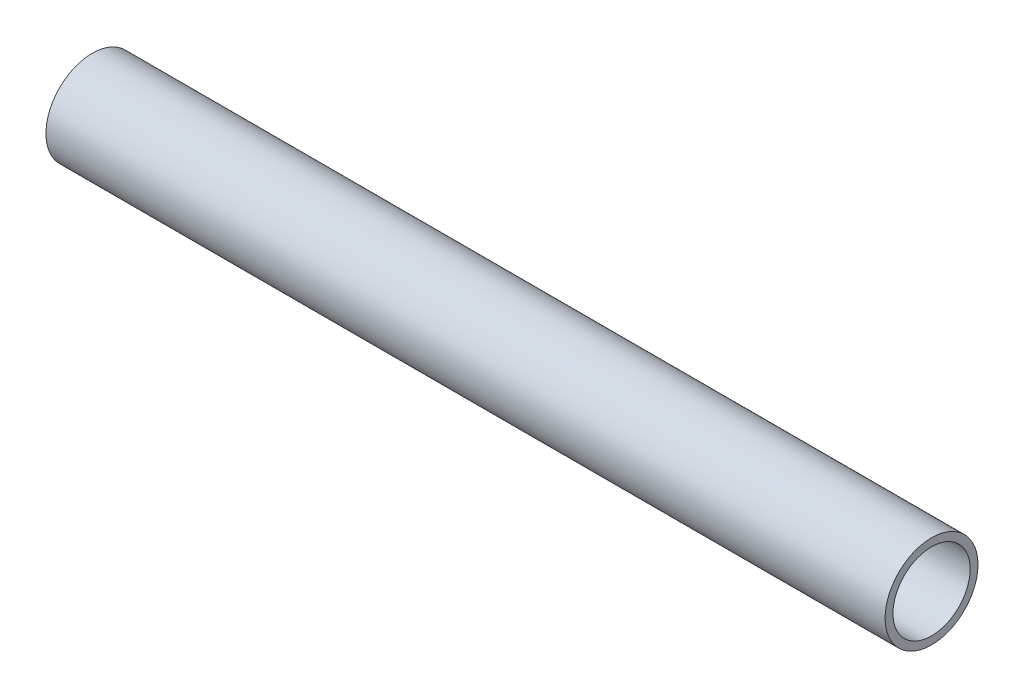
ISO-10303-21;
HEADER;
FILE_DESCRIPTION(('STEP AP214'),'2;1');
FILE_NAME('part.step','',(''),(''),'','','');
FILE_SCHEMA(('AUTOMOTIVE_DESIGN { 1 0 10303 214 1 1 1 1 }'));
ENDSEC;
DATA;
#1=APPLICATION_CONTEXT('core data for automotive mechanical design processes');
#2=APPLICATION_PROTOCOL_DEFINITION('international standard','automotive_design',2000,#1);
#3=PRODUCT_CONTEXT('',#1,'mechanical');
#4=PRODUCT('Part','Part','',(#3));
#5=PRODUCT_RELATED_PRODUCT_CATEGORY('part','',(#4));
#6=PRODUCT_DEFINITION_FORMATION('','',#4);
#7=PRODUCT_DEFINITION_CONTEXT('part definition',#1,'design');
#8=PRODUCT_DEFINITION('design','',#6,#7);
#9=PRODUCT_DEFINITION_SHAPE('','',#8);
#10=(LENGTH_UNIT() NAMED_UNIT(*) SI_UNIT(.MILLI.,.METRE.));
#11=(NAMED_UNIT(*) PLANE_ANGLE_UNIT() SI_UNIT($,.RADIAN.));
#12=(NAMED_UNIT(*) SI_UNIT($,.STERADIAN.) SOLID_ANGLE_UNIT());
#13=UNCERTAINTY_MEASURE_WITH_UNIT(LENGTH_MEASURE(1.E-05),#10,'distance_accuracy_value','');
#14=(GEOMETRIC_REPRESENTATION_CONTEXT(3) GLOBAL_UNCERTAINTY_ASSIGNED_CONTEXT((#13)) GLOBAL_UNIT_ASSIGNED_CONTEXT((#10,
#11,#12)) REPRESENTATION_CONTEXT('',''));
#15=CARTESIAN_POINT('',(0.,0.,0.));
#16=DIRECTION('',(0.,0.,1.));
#17=DIRECTION('',(1.,0.,0.));
#18=AXIS2_PLACEMENT_3D('',#15,#16,#17);
#19=CARTESIAN_POINT('',(190.5,0.,0.));
#20=DIRECTION('',(1.,0.,0.));
#21=DIRECTION('',(0.,0.,-1.));
#22=AXIS2_PLACEMENT_3D('',#19,#20,#21);
#23=PLANE('',#22);
#24=CARTESIAN_POINT('',(190.5,0.,0.));
#25=DIRECTION('',(1.,0.,0.));
#26=DIRECTION('',(0.,0.,-1.));
#27=AXIS2_PLACEMENT_3D('',#24,#25,#26);
#28=CIRCLE('',#27,21.082);
#29=CARTESIAN_POINT('',(190.5,0.,-21.082));
#30=VERTEX_POINT('',#29);
#31=EDGE_CURVE('E10',#30,#30,#28,.T.);
#32=ORIENTED_EDGE('',*,*,#31,.T.);
#33=EDGE_LOOP('',(#32));
#34=FACE_BOUND('',#33,.T.);
#35=CARTESIAN_POINT('',(190.5,0.,0.));
#36=DIRECTION('',(1.,0.,0.));
#37=DIRECTION('',(0.,0.,-1.));
#38=AXIS2_PLACEMENT_3D('',#35,#36,#37);
#39=CIRCLE('',#38,17.526);
#40=CARTESIAN_POINT('',(190.5,0.,-17.526));
#41=VERTEX_POINT('',#40);
#42=EDGE_CURVE('E42',#41,#41,#39,.T.);
#43=ORIENTED_EDGE('',*,*,#42,.F.);
#44=EDGE_LOOP('',(#43));
#45=FACE_BOUND('',#44,.T.);
#46=ADVANCED_FACE('F31',(#34,#45),#23,.T.);
#47=CARTESIAN_POINT('',(-190.5,0.,0.));
#48=DIRECTION('',(1.,0.,0.));
#49=DIRECTION('',(0.,0.,-1.));
#50=AXIS2_PLACEMENT_3D('',#47,#48,#49);
#51=PLANE('',#50);
#52=CARTESIAN_POINT('',(-190.5,0.,0.));
#53=DIRECTION('',(1.,0.,0.));
#54=DIRECTION('',(0.,0.,-1.));
#55=AXIS2_PLACEMENT_3D('',#52,#53,#54);
#56=CIRCLE('',#55,21.082);
#57=CARTESIAN_POINT('',(-190.5,0.,-21.082));
#58=VERTEX_POINT('',#57);
#59=EDGE_CURVE('E35',#58,#58,#56,.T.);
#60=ORIENTED_EDGE('',*,*,#59,.F.);
#61=EDGE_LOOP('',(#60));
#62=FACE_BOUND('',#61,.T.);
#63=CARTESIAN_POINT('',(-190.5,0.,0.));
#64=DIRECTION('',(1.,0.,0.));
#65=DIRECTION('',(0.,0.,-1.));
#66=AXIS2_PLACEMENT_3D('',#63,#64,#65);
#67=CIRCLE('',#66,17.526);
#68=CARTESIAN_POINT('',(-190.5,0.,-17.526));
#69=VERTEX_POINT('',#68);
#70=EDGE_CURVE('E44',#69,#69,#67,.T.);
#71=ORIENTED_EDGE('',*,*,#70,.T.);
#72=EDGE_LOOP('',(#71));
#73=FACE_BOUND('',#72,.T.);
#74=ADVANCED_FACE('F54',(#62,#73),#51,.F.);
#75=CARTESIAN_POINT('',(190.5,0.,0.));
#76=DIRECTION('',(-1.,0.,0.));
#77=DIRECTION('',(0.,0.,1.));
#78=AXIS2_PLACEMENT_3D('',#75,#76,#77);
#79=CYLINDRICAL_SURFACE('',#78,21.082);
#80=ORIENTED_EDGE('',*,*,#31,.F.);
#81=EDGE_LOOP('',(#80));
#82=FACE_BOUND('',#81,.T.);
#83=ORIENTED_EDGE('',*,*,#59,.T.);
#84=EDGE_LOOP('',(#83));
#85=FACE_BOUND('',#84,.T.);
#86=ADVANCED_FACE('F33',(#82,#85),#79,.T.);
#87=CARTESIAN_POINT('',(190.5,0.,0.));
#88=DIRECTION('',(-1.,0.,0.));
#89=DIRECTION('',(0.,0.,1.));
#90=AXIS2_PLACEMENT_3D('',#87,#88,#89);
#91=CYLINDRICAL_SURFACE('',#90,17.526);
#92=ORIENTED_EDGE('',*,*,#42,.T.);
#93=EDGE_LOOP('',(#92));
#94=FACE_BOUND('',#93,.T.);
#95=ORIENTED_EDGE('',*,*,#70,.F.);
#96=EDGE_LOOP('',(#95));
#97=FACE_BOUND('',#96,.T.);
#98=ADVANCED_FACE('F50',(#94,#97),#91,.F.);
#99=CLOSED_SHELL('',(#46,#74,#86,#98));
#100=MANIFOLD_SOLID_BREP('B2',#99);
#101=ADVANCED_BREP_SHAPE_REPRESENTATION('',(#18,#100),#14);
#102=SHAPE_DEFINITION_REPRESENTATION(#9,#101);
ENDSEC;
END-ISO-10303-21;
